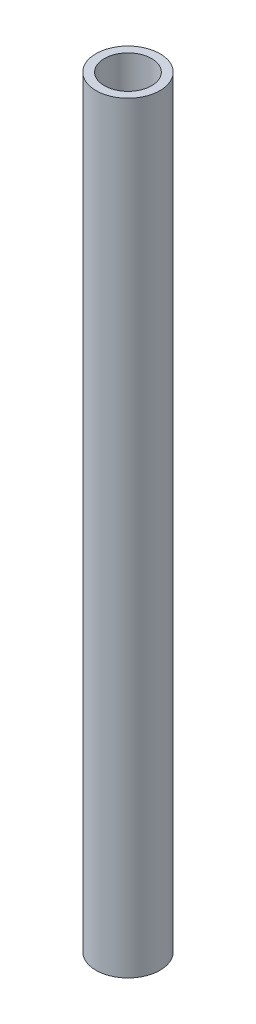
ISO-10303-21;
HEADER;
FILE_DESCRIPTION(('STEP AP214'),'2;1');
FILE_NAME('part.step','',(''),(''),'','','');
FILE_SCHEMA(('AUTOMOTIVE_DESIGN { 1 0 10303 214 1 1 1 1 }'));
ENDSEC;
DATA;
#1=APPLICATION_CONTEXT('core data for automotive mechanical design processes');
#2=APPLICATION_PROTOCOL_DEFINITION('international standard','automotive_design',2000,#1);
#3=PRODUCT_CONTEXT('',#1,'mechanical');
#4=PRODUCT('Part','Part','',(#3));
#5=PRODUCT_RELATED_PRODUCT_CATEGORY('part','',(#4));
#6=PRODUCT_DEFINITION_FORMATION('','',#4);
#7=PRODUCT_DEFINITION_CONTEXT('part definition',#1,'design');
#8=PRODUCT_DEFINITION('design','',#6,#7);
#9=PRODUCT_DEFINITION_SHAPE('','',#8);
#10=(LENGTH_UNIT() NAMED_UNIT(*) SI_UNIT(.MILLI.,.METRE.));
#11=(NAMED_UNIT(*) PLANE_ANGLE_UNIT() SI_UNIT($,.RADIAN.));
#12=(NAMED_UNIT(*) SI_UNIT($,.STERADIAN.) SOLID_ANGLE_UNIT());
#13=UNCERTAINTY_MEASURE_WITH_UNIT(LENGTH_MEASURE(1.E-05),#10,'distance_accuracy_value','');
#14=(GEOMETRIC_REPRESENTATION_CONTEXT(3) GLOBAL_UNCERTAINTY_ASSIGNED_CONTEXT((#13)) GLOBAL_UNIT_ASSIGNED_CONTEXT((#10,
#11,#12)) REPRESENTATION_CONTEXT('',''));
#15=CARTESIAN_POINT('',(0.,0.,0.));
#16=DIRECTION('',(0.,0.,1.));
#17=DIRECTION('',(1.,0.,0.));
#18=AXIS2_PLACEMENT_3D('',#15,#16,#17);
#19=CARTESIAN_POINT('',(0.,127.,0.));
#20=DIRECTION('',(0.,1.,0.));
#21=DIRECTION('',(0.,0.,1.));
#22=AXIS2_PLACEMENT_3D('',#19,#20,#21);
#23=PLANE('',#22);
#24=CARTESIAN_POINT('',(0.,127.,0.));
#25=DIRECTION('',(0.,1.,0.));
#26=DIRECTION('',(0.,0.,1.));
#27=AXIS2_PLACEMENT_3D('',#24,#25,#26);
#28=CIRCLE('',#27,10.668);
#29=CARTESIAN_POINT('',(0.,127.,10.668));
#30=VERTEX_POINT('',#29);
#31=EDGE_CURVE('E10',#30,#30,#28,.T.);
#32=ORIENTED_EDGE('',*,*,#31,.T.);
#33=EDGE_LOOP('',(#32));
#34=FACE_BOUND('',#33,.T.);
#35=CARTESIAN_POINT('',(0.,127.,0.));
#36=DIRECTION('',(0.,1.,0.));
#37=DIRECTION('',(0.,0.,1.));
#38=AXIS2_PLACEMENT_3D('',#35,#36,#37);
#39=CIRCLE('',#38,7.874);
#40=CARTESIAN_POINT('',(0.,127.,7.874));
#41=VERTEX_POINT('',#40);
#42=EDGE_CURVE('E42',#41,#41,#39,.T.);
#43=ORIENTED_EDGE('',*,*,#42,.F.);
#44=EDGE_LOOP('',(#43));
#45=FACE_BOUND('',#44,.T.);
#46=ADVANCED_FACE('F31',(#34,#45),#23,.T.);
#47=CARTESIAN_POINT('',(0.,-127.,0.));
#48=DIRECTION('',(0.,1.,0.));
#49=DIRECTION('',(0.,0.,1.));
#50=AXIS2_PLACEMENT_3D('',#47,#48,#49);
#51=PLANE('',#50);
#52=CARTESIAN_POINT('',(0.,-127.,0.));
#53=DIRECTION('',(0.,1.,0.));
#54=DIRECTION('',(0.,0.,1.));
#55=AXIS2_PLACEMENT_3D('',#52,#53,#54);
#56=CIRCLE('',#55,10.668);
#57=CARTESIAN_POINT('',(0.,-127.,10.668));
#58=VERTEX_POINT('',#57);
#59=EDGE_CURVE('E35',#58,#58,#56,.T.);
#60=ORIENTED_EDGE('',*,*,#59,.F.);
#61=EDGE_LOOP('',(#60));
#62=FACE_BOUND('',#61,.T.);
#63=CARTESIAN_POINT('',(0.,-127.,0.));
#64=DIRECTION('',(0.,1.,0.));
#65=DIRECTION('',(0.,0.,1.));
#66=AXIS2_PLACEMENT_3D('',#63,#64,#65);
#67=CIRCLE('',#66,7.874);
#68=CARTESIAN_POINT('',(0.,-127.,7.874));
#69=VERTEX_POINT('',#68);
#70=EDGE_CURVE('E44',#69,#69,#67,.T.);
#71=ORIENTED_EDGE('',*,*,#70,.T.);
#72=EDGE_LOOP('',(#71));
#73=FACE_BOUND('',#72,.T.);
#74=ADVANCED_FACE('F54',(#62,#73),#51,.F.);
#75=CARTESIAN_POINT('',(0.,127.,0.));
#76=DIRECTION('',(0.,-1.,0.));
#77=DIRECTION('',(0.,0.,-1.));
#78=AXIS2_PLACEMENT_3D('',#75,#76,#77);
#79=CYLINDRICAL_SURFACE('',#78,10.668);
#80=ORIENTED_EDGE('',*,*,#31,.F.);
#81=EDGE_LOOP('',(#80));
#82=FACE_BOUND('',#81,.T.);
#83=ORIENTED_EDGE('',*,*,#59,.T.);
#84=EDGE_LOOP('',(#83));
#85=FACE_BOUND('',#84,.T.);
#86=ADVANCED_FACE('F33',(#82,#85),#79,.T.);
#87=CARTESIAN_POINT('',(0.,127.,0.));
#88=DIRECTION('',(0.,-1.,0.));
#89=DIRECTION('',(0.,0.,-1.));
#90=AXIS2_PLACEMENT_3D('',#87,#88,#89);
#91=CYLINDRICAL_SURFACE('',#90,7.874);
#92=ORIENTED_EDGE('',*,*,#42,.T.);
#93=EDGE_LOOP('',(#92));
#94=FACE_BOUND('',#93,.T.);
#95=ORIENTED_EDGE('',*,*,#70,.F.);
#96=EDGE_LOOP('',(#95));
#97=FACE_BOUND('',#96,.T.);
#98=ADVANCED_FACE('F50',(#94,#97),#91,.F.);
#99=CLOSED_SHELL('',(#46,#74,#86,#98));
#100=MANIFOLD_SOLID_BREP('B2',#99);
#101=ADVANCED_BREP_SHAPE_REPRESENTATION('',(#18,#100),#14);
#102=SHAPE_DEFINITION_REPRESENTATION(#9,#101);
ENDSEC;
END-ISO-10303-21;
